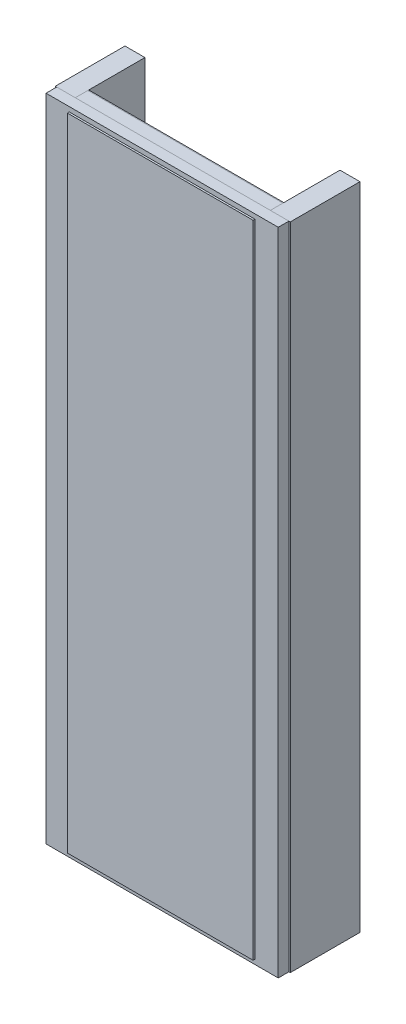
ISO-10303-21;
HEADER;
FILE_DESCRIPTION(('STEP AP214'),'2;1');
FILE_NAME('part.step','',(''),(''),'','','');
FILE_SCHEMA(('AUTOMOTIVE_DESIGN { 1 0 10303 214 1 1 1 1 }'));
ENDSEC;
DATA;
#1=APPLICATION_CONTEXT('core data for automotive mechanical design processes');
#2=APPLICATION_PROTOCOL_DEFINITION('international standard','automotive_design',2000,#1);
#3=PRODUCT_CONTEXT('',#1,'mechanical');
#4=PRODUCT('Part','Part','',(#3));
#5=PRODUCT_RELATED_PRODUCT_CATEGORY('part','',(#4));
#6=PRODUCT_DEFINITION_FORMATION('','',#4);
#7=PRODUCT_DEFINITION_CONTEXT('part definition',#1,'design');
#8=PRODUCT_DEFINITION('design','',#6,#7);
#9=PRODUCT_DEFINITION_SHAPE('','',#8);
#10=(LENGTH_UNIT() NAMED_UNIT(*) SI_UNIT(.MILLI.,.METRE.));
#11=(NAMED_UNIT(*) PLANE_ANGLE_UNIT() SI_UNIT($,.RADIAN.));
#12=(NAMED_UNIT(*) SI_UNIT($,.STERADIAN.) SOLID_ANGLE_UNIT());
#13=UNCERTAINTY_MEASURE_WITH_UNIT(LENGTH_MEASURE(1.E-05),#10,'distance_accuracy_value','');
#14=(GEOMETRIC_REPRESENTATION_CONTEXT(3) GLOBAL_UNCERTAINTY_ASSIGNED_CONTEXT((#13)) GLOBAL_UNIT_ASSIGNED_CONTEXT((#10,
#11,#12)) REPRESENTATION_CONTEXT('',''));
#15=CARTESIAN_POINT('',(0.,0.,0.));
#16=DIRECTION('',(0.,0.,1.));
#17=DIRECTION('',(1.,0.,0.));
#18=AXIS2_PLACEMENT_3D('',#15,#16,#17);
#19=CARTESIAN_POINT('',(0.,0.,8.65));
#20=DIRECTION('',(0.,0.,1.));
#21=DIRECTION('',(1.,0.,0.));
#22=AXIS2_PLACEMENT_3D('',#19,#20,#21);
#23=PLANE('',#22);
#24=DIRECTION('',(1.,0.,0.));
#25=VECTOR('',#24,1.);
#26=CARTESIAN_POINT('',(10.,34.5,8.65));
#27=LINE('',#26,#25);
#28=CARTESIAN_POINT('',(-10.,34.5,8.65));
#29=VERTEX_POINT('',#28);
#30=CARTESIAN_POINT('',(9.99999999999999,34.5,8.65));
#31=VERTEX_POINT('',#30);
#32=EDGE_CURVE('P0_E81',#29,#31,#27,.T.);
#33=ORIENTED_EDGE('',*,*,#32,.T.);
#34=DIRECTION('',(0.,-1.,0.));
#35=VECTOR('',#34,1.);
#36=CARTESIAN_POINT('',(10.,-34.5,8.65));
#37=LINE('',#36,#35);
#38=CARTESIAN_POINT('',(10.,-34.5,8.65));
#39=VERTEX_POINT('',#38);
#40=EDGE_CURVE('P0_E68',#31,#39,#37,.T.);
#41=ORIENTED_EDGE('',*,*,#40,.T.);
#42=DIRECTION('',(1.,0.,0.));
#43=VECTOR('',#42,1.);
#44=CARTESIAN_POINT('',(-10.,-34.5,8.65));
#45=LINE('',#44,#43);
#46=CARTESIAN_POINT('',(-10.,-34.5,8.65));
#47=VERTEX_POINT('',#46);
#48=EDGE_CURVE('P0_E55',#39,#47,#45,.F.);
#49=ORIENTED_EDGE('',*,*,#48,.T.);
#50=DIRECTION('',(0.,1.,0.));
#51=VECTOR('',#50,1.);
#52=CARTESIAN_POINT('',(-10.,34.5,8.65));
#53=LINE('',#52,#51);
#54=EDGE_CURVE('P0_E20',#47,#29,#53,.T.);
#55=ORIENTED_EDGE('',*,*,#54,.T.);
#56=EDGE_LOOP('',(#33,#41,#49,#55));
#57=FACE_BOUND('',#56,.T.);
#58=ADVANCED_FACE('P0_F17',(#57),#23,.F.);
#59=CARTESIAN_POINT('',(-10.,34.5,8.85));
#60=DIRECTION('',(1.,0.,0.));
#61=DIRECTION('',(0.,1.,0.));
#62=AXIS2_PLACEMENT_3D('',#59,#60,#61);
#63=PLANE('',#62);
#64=DIRECTION('',(0.,0.,1.));
#65=VECTOR('',#64,1.);
#66=CARTESIAN_POINT('',(-10.,-34.5,8.85));
#67=LINE('',#66,#65);
#68=CARTESIAN_POINT('',(-10.,-34.5,8.85));
#69=VERTEX_POINT('',#68);
#70=EDGE_CURVE('P0_E61',#47,#69,#67,.T.);
#71=ORIENTED_EDGE('',*,*,#70,.T.);
#72=DIRECTION('',(0.,1.,0.));
#73=VECTOR('',#72,1.);
#74=CARTESIAN_POINT('',(-10.,0.,8.85));
#75=LINE('',#74,#73);
#76=CARTESIAN_POINT('',(-10.,34.5,8.85));
#77=VERTEX_POINT('',#76);
#78=EDGE_CURVE('P0_E83',#77,#69,#75,.F.);
#79=ORIENTED_EDGE('',*,*,#78,.F.);
#80=DIRECTION('',(0.,0.,-1.));
#81=VECTOR('',#80,1.);
#82=CARTESIAN_POINT('',(-10.,34.5,8.85));
#83=LINE('',#82,#81);
#84=EDGE_CURVE('P0_E64',#77,#29,#83,.T.);
#85=ORIENTED_EDGE('',*,*,#84,.T.);
#86=ORIENTED_EDGE('',*,*,#54,.F.);
#87=EDGE_LOOP('',(#71,#79,#85,#86));
#88=FACE_BOUND('',#87,.T.);
#89=ADVANCED_FACE('P0_F60',(#88),#63,.F.);
#90=CARTESIAN_POINT('',(-10.,-34.5,8.85));
#91=DIRECTION('',(0.,1.,0.));
#92=DIRECTION('',(0.,0.,1.));
#93=AXIS2_PLACEMENT_3D('',#90,#91,#92);
#94=PLANE('',#93);
#95=DIRECTION('',(0.,0.,1.));
#96=VECTOR('',#95,1.);
#97=CARTESIAN_POINT('',(10.,-34.5,8.85));
#98=LINE('',#97,#96);
#99=CARTESIAN_POINT('',(10.,-34.5,8.85));
#100=VERTEX_POINT('',#99);
#101=EDGE_CURVE('P0_E70',#39,#100,#98,.T.);
#102=ORIENTED_EDGE('',*,*,#101,.T.);
#103=DIRECTION('',(1.,0.,0.));
#104=VECTOR('',#103,1.);
#105=CARTESIAN_POINT('',(0.,-34.5,8.85));
#106=LINE('',#105,#104);
#107=EDGE_CURVE('P0_E74',#69,#100,#106,.T.);
#108=ORIENTED_EDGE('',*,*,#107,.F.);
#109=ORIENTED_EDGE('',*,*,#70,.F.);
#110=ORIENTED_EDGE('',*,*,#48,.F.);
#111=EDGE_LOOP('',(#102,#108,#109,#110));
#112=FACE_BOUND('',#111,.T.);
#113=ADVANCED_FACE('P0_F72',(#112),#94,.F.);
#114=CARTESIAN_POINT('',(10.,-34.5,8.85));
#115=DIRECTION('',(-1.,0.,0.));
#116=DIRECTION('',(0.,-1.,0.));
#117=AXIS2_PLACEMENT_3D('',#114,#115,#116);
#118=PLANE('',#117);
#119=DIRECTION('',(0.,0.,-1.));
#120=VECTOR('',#119,1.);
#121=CARTESIAN_POINT('',(10.,34.5,8.85));
#122=LINE('',#121,#120);
#123=CARTESIAN_POINT('',(9.99999999999999,34.5,8.85));
#124=VERTEX_POINT('',#123);
#125=EDGE_CURVE('P0_E35',#31,#124,#122,.F.);
#126=ORIENTED_EDGE('',*,*,#125,.T.);
#127=DIRECTION('',(0.,1.,0.));
#128=VECTOR('',#127,1.);
#129=CARTESIAN_POINT('',(10.,0.,8.85));
#130=LINE('',#129,#128);
#131=EDGE_CURVE('P0_E26',#100,#124,#130,.T.);
#132=ORIENTED_EDGE('',*,*,#131,.F.);
#133=ORIENTED_EDGE('',*,*,#101,.F.);
#134=ORIENTED_EDGE('',*,*,#40,.F.);
#135=EDGE_LOOP('',(#126,#132,#133,#134));
#136=FACE_BOUND('',#135,.T.);
#137=ADVANCED_FACE('P0_F89',(#136),#118,.F.);
#138=CARTESIAN_POINT('',(10.,34.5,8.85));
#139=DIRECTION('',(0.,-1.,0.));
#140=DIRECTION('',(0.,0.,-1.));
#141=AXIS2_PLACEMENT_3D('',#138,#139,#140);
#142=PLANE('',#141);
#143=ORIENTED_EDGE('',*,*,#84,.F.);
#144=DIRECTION('',(1.,0.,0.));
#145=VECTOR('',#144,1.);
#146=CARTESIAN_POINT('',(0.,34.5,8.85));
#147=LINE('',#146,#145);
#148=EDGE_CURVE('P0_E11',#124,#77,#147,.F.);
#149=ORIENTED_EDGE('',*,*,#148,.F.);
#150=ORIENTED_EDGE('',*,*,#125,.F.);
#151=ORIENTED_EDGE('',*,*,#32,.F.);
#152=EDGE_LOOP('',(#143,#149,#150,#151));
#153=FACE_BOUND('',#152,.T.);
#154=ADVANCED_FACE('P0_F91',(#153),#142,.F.);
#155=CARTESIAN_POINT('',(0.,0.,8.85));
#156=DIRECTION('',(0.,0.,1.));
#157=DIRECTION('',(1.,0.,0.));
#158=AXIS2_PLACEMENT_3D('',#155,#156,#157);
#159=PLANE('',#158);
#160=ORIENTED_EDGE('',*,*,#131,.T.);
#161=ORIENTED_EDGE('',*,*,#148,.T.);
#162=ORIENTED_EDGE('',*,*,#78,.T.);
#163=ORIENTED_EDGE('',*,*,#107,.T.);
#164=EDGE_LOOP('',(#160,#161,#162,#163));
#165=FACE_BOUND('',#164,.T.);
#166=ADVANCED_FACE('P0_F88',(#165),#159,.T.);
#167=CLOSED_SHELL('',(#58,#89,#113,#137,#154,#166));
#168=MANIFOLD_SOLID_BREP('P0_B1',#167);
#169=CARTESIAN_POINT('',(-10.5,35.,0.));
#170=DIRECTION('',(-1.,0.,0.));
#171=DIRECTION('',(0.,0.,1.));
#172=AXIS2_PLACEMENT_3D('',#169,#170,#171);
#173=PLANE('',#172);
#174=DIRECTION('',(0.,0.,1.));
#175=VECTOR('',#174,1.);
#176=CARTESIAN_POINT('',(-10.5,-35.,0.));
#177=LINE('',#176,#175);
#178=CARTESIAN_POINT('',(-10.5,-35.,7.5));
#179=VERTEX_POINT('',#178);
#180=CARTESIAN_POINT('',(-10.5,-35.,0.));
#181=VERTEX_POINT('',#180);
#182=EDGE_CURVE('P1_E20',#179,#181,#177,.F.);
#183=ORIENTED_EDGE('',*,*,#182,.T.);
#184=DIRECTION('',(0.,1.,0.));
#185=VECTOR('',#184,1.);
#186=CARTESIAN_POINT('',(-10.5,0.,0.));
#187=LINE('',#186,#185);
#188=CARTESIAN_POINT('',(-10.5,35.,0.));
#189=VERTEX_POINT('',#188);
#190=EDGE_CURVE('P1_E55',#189,#181,#187,.F.);
#191=ORIENTED_EDGE('',*,*,#190,.F.);
#192=DIRECTION('',(0.,0.,-1.));
#193=VECTOR('',#192,1.);
#194=CARTESIAN_POINT('',(-10.5,35.,0.));
#195=LINE('',#194,#193);
#196=CARTESIAN_POINT('',(-10.5,35.,7.5));
#197=VERTEX_POINT('',#196);
#198=EDGE_CURVE('P1_E74',#189,#197,#195,.F.);
#199=ORIENTED_EDGE('',*,*,#198,.T.);
#200=DIRECTION('',(0.,1.,0.));
#201=VECTOR('',#200,1.);
#202=CARTESIAN_POINT('',(-10.5,0.,7.5));
#203=LINE('',#202,#201);
#204=EDGE_CURVE('P1_E66',#197,#179,#203,.F.);
#205=ORIENTED_EDGE('',*,*,#204,.T.);
#206=EDGE_LOOP('',(#183,#191,#199,#205));
#207=FACE_BOUND('',#206,.T.);
#208=ADVANCED_FACE('P1_F17',(#207),#173,.F.);
#209=CARTESIAN_POINT('',(-10.5,-35.,0.));
#210=DIRECTION('',(0.,1.,0.));
#211=DIRECTION('',(0.,0.,1.));
#212=AXIS2_PLACEMENT_3D('',#209,#210,#211);
#213=PLANE('',#212);
#214=DIRECTION('',(0.,0.,1.));
#215=VECTOR('',#214,1.);
#216=CARTESIAN_POINT('',(-12.65,-35.,0.));
#217=LINE('',#216,#215);
#218=CARTESIAN_POINT('',(-12.65,-35.,7.5));
#219=VERTEX_POINT('',#218);
#220=CARTESIAN_POINT('',(-12.65,-35.,0.));
#221=VERTEX_POINT('',#220);
#222=EDGE_CURVE('P1_E72',#219,#221,#217,.F.);
#223=ORIENTED_EDGE('',*,*,#222,.T.);
#224=DIRECTION('',(-1.,0.,0.));
#225=VECTOR('',#224,1.);
#226=CARTESIAN_POINT('',(0.,-35.,0.));
#227=LINE('',#226,#225);
#228=EDGE_CURVE('P1_E62',#181,#221,#227,.T.);
#229=ORIENTED_EDGE('',*,*,#228,.F.);
#230=ORIENTED_EDGE('',*,*,#182,.F.);
#231=DIRECTION('',(-1.,0.,0.));
#232=VECTOR('',#231,1.);
#233=CARTESIAN_POINT('',(0.,-35.,7.5));
#234=LINE('',#233,#232);
#235=EDGE_CURVE('P1_E80',#179,#219,#234,.T.);
#236=ORIENTED_EDGE('',*,*,#235,.T.);
#237=EDGE_LOOP('',(#223,#229,#230,#236));
#238=FACE_BOUND('',#237,.T.);
#239=ADVANCED_FACE('P1_F71',(#238),#213,.F.);
#240=CARTESIAN_POINT('',(0.,0.,0.));
#241=DIRECTION('',(0.,0.,-1.));
#242=DIRECTION('',(-1.,0.,0.));
#243=AXIS2_PLACEMENT_3D('',#240,#241,#242);
#244=PLANE('',#243);
#245=ORIENTED_EDGE('',*,*,#190,.T.);
#246=ORIENTED_EDGE('',*,*,#228,.T.);
#247=DIRECTION('',(0.,1.,0.));
#248=VECTOR('',#247,1.);
#249=CARTESIAN_POINT('',(-12.65,-35.,0.));
#250=LINE('',#249,#248);
#251=CARTESIAN_POINT('',(-12.65,35.,0.));
#252=VERTEX_POINT('',#251);
#253=EDGE_CURVE('P1_E83',#221,#252,#250,.T.);
#254=ORIENTED_EDGE('',*,*,#253,.T.);
#255=DIRECTION('',(1.,0.,0.));
#256=VECTOR('',#255,1.);
#257=CARTESIAN_POINT('',(-12.65,35.,0.));
#258=LINE('',#257,#256);
#259=EDGE_CURVE('P1_E64',#252,#189,#258,.T.);
#260=ORIENTED_EDGE('',*,*,#259,.T.);
#261=EDGE_LOOP('',(#245,#246,#254,#260));
#262=FACE_BOUND('',#261,.T.);
#263=ADVANCED_FACE('P1_F59',(#262),#244,.T.);
#264=CARTESIAN_POINT('',(-12.65,35.,0.));
#265=DIRECTION('',(0.,-1.,0.));
#266=DIRECTION('',(0.,0.,-1.));
#267=AXIS2_PLACEMENT_3D('',#264,#265,#266);
#268=PLANE('',#267);
#269=ORIENTED_EDGE('',*,*,#198,.F.);
#270=ORIENTED_EDGE('',*,*,#259,.F.);
#271=DIRECTION('',(0.,0.,1.));
#272=VECTOR('',#271,1.);
#273=CARTESIAN_POINT('',(-12.65,35.,0.));
#274=LINE('',#273,#272);
#275=CARTESIAN_POINT('',(-12.65,35.,7.5));
#276=VERTEX_POINT('',#275);
#277=EDGE_CURVE('P1_E26',#252,#276,#274,.T.);
#278=ORIENTED_EDGE('',*,*,#277,.T.);
#279=DIRECTION('',(-1.,0.,0.));
#280=VECTOR('',#279,1.);
#281=CARTESIAN_POINT('',(0.,35.,7.5));
#282=LINE('',#281,#280);
#283=EDGE_CURVE('P1_E34',#276,#197,#282,.F.);
#284=ORIENTED_EDGE('',*,*,#283,.T.);
#285=EDGE_LOOP('',(#269,#270,#278,#284));
#286=FACE_BOUND('',#285,.T.);
#287=ADVANCED_FACE('P1_F88',(#286),#268,.F.);
#288=CARTESIAN_POINT('',(0.,0.,7.5));
#289=DIRECTION('',(0.,0.,-1.));
#290=DIRECTION('',(-1.,0.,0.));
#291=AXIS2_PLACEMENT_3D('',#288,#289,#290);
#292=PLANE('',#291);
#293=ORIENTED_EDGE('',*,*,#235,.F.);
#294=ORIENTED_EDGE('',*,*,#204,.F.);
#295=ORIENTED_EDGE('',*,*,#283,.F.);
#296=DIRECTION('',(0.,1.,0.));
#297=VECTOR('',#296,1.);
#298=CARTESIAN_POINT('',(-12.65,-35.,7.5));
#299=LINE('',#298,#297);
#300=EDGE_CURVE('P1_E11',#276,#219,#299,.F.);
#301=ORIENTED_EDGE('',*,*,#300,.T.);
#302=EDGE_LOOP('',(#293,#294,#295,#301));
#303=FACE_BOUND('',#302,.T.);
#304=ADVANCED_FACE('P1_F91',(#303),#292,.F.);
#305=CARTESIAN_POINT('',(-12.65,-35.,0.));
#306=DIRECTION('',(1.,0.,0.));
#307=DIRECTION('',(0.,1.,0.));
#308=AXIS2_PLACEMENT_3D('',#305,#306,#307);
#309=PLANE('',#308);
#310=ORIENTED_EDGE('',*,*,#277,.F.);
#311=ORIENTED_EDGE('',*,*,#253,.F.);
#312=ORIENTED_EDGE('',*,*,#222,.F.);
#313=ORIENTED_EDGE('',*,*,#300,.F.);
#314=EDGE_LOOP('',(#310,#311,#312,#313));
#315=FACE_BOUND('',#314,.T.);
#316=ADVANCED_FACE('P1_F90',(#315),#309,.F.);
#317=CLOSED_SHELL('',(#208,#239,#263,#287,#304,#316));
#318=MANIFOLD_SOLID_BREP('P1_B1',#317);
#319=CARTESIAN_POINT('',(0.,0.,6.15));
#320=DIRECTION('',(0.,0.,-1.));
#321=DIRECTION('',(-1.,0.,0.));
#322=AXIS2_PLACEMENT_3D('',#319,#320,#321);
#323=PLANE('',#322);
#324=DIRECTION('',(1.,0.,0.));
#325=VECTOR('',#324,1.);
#326=CARTESIAN_POINT('',(10.5,-35.,6.15));
#327=LINE('',#326,#325);
#328=CARTESIAN_POINT('',(-10.5,-35.,6.15));
#329=VERTEX_POINT('',#328);
#330=CARTESIAN_POINT('',(10.5,-35.,6.15));
#331=VERTEX_POINT('',#330);
#332=EDGE_CURVE('P2_E81',#329,#331,#327,.T.);
#333=ORIENTED_EDGE('',*,*,#332,.T.);
#334=DIRECTION('',(0.,1.,0.));
#335=VECTOR('',#334,1.);
#336=CARTESIAN_POINT('',(10.5,35.,6.15));
#337=LINE('',#336,#335);
#338=CARTESIAN_POINT('',(10.5,35.,6.15));
#339=VERTEX_POINT('',#338);
#340=EDGE_CURVE('P2_E68',#331,#339,#337,.T.);
#341=ORIENTED_EDGE('',*,*,#340,.T.);
#342=DIRECTION('',(1.,0.,0.));
#343=VECTOR('',#342,1.);
#344=CARTESIAN_POINT('',(-10.5,35.,6.15));
#345=LINE('',#344,#343);
#346=CARTESIAN_POINT('',(-10.5,35.,6.15));
#347=VERTEX_POINT('',#346);
#348=EDGE_CURVE('P2_E55',#339,#347,#345,.F.);
#349=ORIENTED_EDGE('',*,*,#348,.T.);
#350=DIRECTION('',(0.,1.,0.));
#351=VECTOR('',#350,1.);
#352=CARTESIAN_POINT('',(-10.5,-35.,6.15));
#353=LINE('',#352,#351);
#354=EDGE_CURVE('P2_E20',#347,#329,#353,.F.);
#355=ORIENTED_EDGE('',*,*,#354,.T.);
#356=EDGE_LOOP('',(#333,#341,#349,#355));
#357=FACE_BOUND('',#356,.T.);
#358=ADVANCED_FACE('P2_F17',(#357),#323,.F.);
#359=CARTESIAN_POINT('',(-10.5,-35.,6.05));
#360=DIRECTION('',(1.,0.,0.));
#361=DIRECTION('',(0.,0.,-1.));
#362=AXIS2_PLACEMENT_3D('',#359,#360,#361);
#363=PLANE('',#362);
#364=DIRECTION('',(0.,0.,-1.));
#365=VECTOR('',#364,1.);
#366=CARTESIAN_POINT('',(-10.5,35.,6.05));
#367=LINE('',#366,#365);
#368=CARTESIAN_POINT('',(-10.5,35.,6.05));
#369=VERTEX_POINT('',#368);
#370=EDGE_CURVE('P2_E61',#347,#369,#367,.T.);
#371=ORIENTED_EDGE('',*,*,#370,.T.);
#372=DIRECTION('',(0.,1.,0.));
#373=VECTOR('',#372,1.);
#374=CARTESIAN_POINT('',(-10.5,0.,6.05));
#375=LINE('',#374,#373);
#376=CARTESIAN_POINT('',(-10.5,-35.,6.05));
#377=VERTEX_POINT('',#376);
#378=EDGE_CURVE('P2_E83',#377,#369,#375,.T.);
#379=ORIENTED_EDGE('',*,*,#378,.F.);
#380=DIRECTION('',(0.,0.,1.));
#381=VECTOR('',#380,1.);
#382=CARTESIAN_POINT('',(-10.5,-35.,6.05));
#383=LINE('',#382,#381);
#384=EDGE_CURVE('P2_E64',#377,#329,#383,.T.);
#385=ORIENTED_EDGE('',*,*,#384,.T.);
#386=ORIENTED_EDGE('',*,*,#354,.F.);
#387=EDGE_LOOP('',(#371,#379,#385,#386));
#388=FACE_BOUND('',#387,.T.);
#389=ADVANCED_FACE('P2_F60',(#388),#363,.F.);
#390=CARTESIAN_POINT('',(-10.5,35.,6.05));
#391=DIRECTION('',(0.,-1.,0.));
#392=DIRECTION('',(0.,0.,-1.));
#393=AXIS2_PLACEMENT_3D('',#390,#391,#392);
#394=PLANE('',#393);
#395=DIRECTION('',(0.,0.,1.));
#396=VECTOR('',#395,1.);
#397=CARTESIAN_POINT('',(10.5,35.,6.05));
#398=LINE('',#397,#396);
#399=CARTESIAN_POINT('',(10.5,35.,6.05));
#400=VERTEX_POINT('',#399);
#401=EDGE_CURVE('P2_E70',#339,#400,#398,.F.);
#402=ORIENTED_EDGE('',*,*,#401,.T.);
#403=DIRECTION('',(-1.,0.,0.));
#404=VECTOR('',#403,1.);
#405=CARTESIAN_POINT('',(0.,35.,6.05));
#406=LINE('',#405,#404);
#407=EDGE_CURVE('P2_E74',#369,#400,#406,.F.);
#408=ORIENTED_EDGE('',*,*,#407,.F.);
#409=ORIENTED_EDGE('',*,*,#370,.F.);
#410=ORIENTED_EDGE('',*,*,#348,.F.);
#411=EDGE_LOOP('',(#402,#408,#409,#410));
#412=FACE_BOUND('',#411,.T.);
#413=ADVANCED_FACE('P2_F72',(#412),#394,.F.);
#414=CARTESIAN_POINT('',(10.5,35.,6.05));
#415=DIRECTION('',(-1.,0.,0.));
#416=DIRECTION('',(0.,0.,1.));
#417=AXIS2_PLACEMENT_3D('',#414,#415,#416);
#418=PLANE('',#417);
#419=DIRECTION('',(0.,0.,1.));
#420=VECTOR('',#419,1.);
#421=CARTESIAN_POINT('',(10.5,-35.,6.05));
#422=LINE('',#421,#420);
#423=CARTESIAN_POINT('',(10.5,-35.,6.05));
#424=VERTEX_POINT('',#423);
#425=EDGE_CURVE('P2_E35',#331,#424,#422,.F.);
#426=ORIENTED_EDGE('',*,*,#425,.T.);
#427=DIRECTION('',(0.,1.,0.));
#428=VECTOR('',#427,1.);
#429=CARTESIAN_POINT('',(10.5,0.,6.05));
#430=LINE('',#429,#428);
#431=EDGE_CURVE('P2_E26',#400,#424,#430,.F.);
#432=ORIENTED_EDGE('',*,*,#431,.F.);
#433=ORIENTED_EDGE('',*,*,#401,.F.);
#434=ORIENTED_EDGE('',*,*,#340,.F.);
#435=EDGE_LOOP('',(#426,#432,#433,#434));
#436=FACE_BOUND('',#435,.T.);
#437=ADVANCED_FACE('P2_F89',(#436),#418,.F.);
#438=CARTESIAN_POINT('',(10.5,-35.,6.05));
#439=DIRECTION('',(0.,1.,0.));
#440=DIRECTION('',(0.,0.,1.));
#441=AXIS2_PLACEMENT_3D('',#438,#439,#440);
#442=PLANE('',#441);
#443=ORIENTED_EDGE('',*,*,#384,.F.);
#444=DIRECTION('',(-1.,0.,0.));
#445=VECTOR('',#444,1.);
#446=CARTESIAN_POINT('',(0.,-35.,6.05));
#447=LINE('',#446,#445);
#448=EDGE_CURVE('P2_E11',#424,#377,#447,.T.);
#449=ORIENTED_EDGE('',*,*,#448,.F.);
#450=ORIENTED_EDGE('',*,*,#425,.F.);
#451=ORIENTED_EDGE('',*,*,#332,.F.);
#452=EDGE_LOOP('',(#443,#449,#450,#451));
#453=FACE_BOUND('',#452,.T.);
#454=ADVANCED_FACE('P2_F91',(#453),#442,.F.);
#455=CARTESIAN_POINT('',(0.,0.,6.05));
#456=DIRECTION('',(0.,0.,-1.));
#457=DIRECTION('',(-1.,0.,0.));
#458=AXIS2_PLACEMENT_3D('',#455,#456,#457);
#459=PLANE('',#458);
#460=ORIENTED_EDGE('',*,*,#431,.T.);
#461=ORIENTED_EDGE('',*,*,#448,.T.);
#462=ORIENTED_EDGE('',*,*,#378,.T.);
#463=ORIENTED_EDGE('',*,*,#407,.T.);
#464=EDGE_LOOP('',(#460,#461,#462,#463));
#465=FACE_BOUND('',#464,.T.);
#466=ADVANCED_FACE('P2_F88',(#465),#459,.T.);
#467=CLOSED_SHELL('',(#358,#389,#413,#437,#454,#466));
#468=MANIFOLD_SOLID_BREP('P2_B1',#467);
#469=CARTESIAN_POINT('',(0.,0.,8.65));
#470=DIRECTION('',(0.,0.,-1.));
#471=DIRECTION('',(-1.,0.,0.));
#472=AXIS2_PLACEMENT_3D('',#469,#470,#471);
#473=PLANE('',#472);
#474=DIRECTION('',(0.,-1.,0.));
#475=VECTOR('',#474,1.);
#476=CARTESIAN_POINT('',(12.5,35.,8.65));
#477=LINE('',#476,#475);
#478=CARTESIAN_POINT('',(12.5,-35.,8.65));
#479=VERTEX_POINT('',#478);
#480=CARTESIAN_POINT('',(12.5,35.,8.65));
#481=VERTEX_POINT('',#480);
#482=EDGE_CURVE('P3_E81',#479,#481,#477,.F.);
#483=ORIENTED_EDGE('',*,*,#482,.T.);
#484=DIRECTION('',(1.,0.,0.));
#485=VECTOR('',#484,1.);
#486=CARTESIAN_POINT('',(-12.5,35.,8.65));
#487=LINE('',#486,#485);
#488=CARTESIAN_POINT('',(-12.5,35.,8.65));
#489=VERTEX_POINT('',#488);
#490=EDGE_CURVE('P3_E68',#481,#489,#487,.F.);
#491=ORIENTED_EDGE('',*,*,#490,.T.);
#492=DIRECTION('',(0.,1.,0.));
#493=VECTOR('',#492,1.);
#494=CARTESIAN_POINT('',(-12.5,-35.,8.65));
#495=LINE('',#494,#493);
#496=CARTESIAN_POINT('',(-12.5,-35.,8.65));
#497=VERTEX_POINT('',#496);
#498=EDGE_CURVE('P3_E55',#489,#497,#495,.F.);
#499=ORIENTED_EDGE('',*,*,#498,.T.);
#500=DIRECTION('',(-1.,0.,0.));
#501=VECTOR('',#500,1.);
#502=CARTESIAN_POINT('',(12.5,-35.,8.65));
#503=LINE('',#502,#501);
#504=EDGE_CURVE('P3_E20',#497,#479,#503,.F.);
#505=ORIENTED_EDGE('',*,*,#504,.T.);
#506=EDGE_LOOP('',(#483,#491,#499,#505));
#507=FACE_BOUND('',#506,.T.);
#508=ADVANCED_FACE('P3_F17',(#507),#473,.F.);
#509=CARTESIAN_POINT('',(12.5,-35.,7.5));
#510=DIRECTION('',(0.,1.,0.));
#511=DIRECTION('',(-1.,0.,0.));
#512=AXIS2_PLACEMENT_3D('',#509,#510,#511);
#513=PLANE('',#512);
#514=DIRECTION('',(0.,0.,1.));
#515=VECTOR('',#514,1.);
#516=CARTESIAN_POINT('',(-12.5,-35.,7.5));
#517=LINE('',#516,#515);
#518=CARTESIAN_POINT('',(-12.5,-35.,7.5));
#519=VERTEX_POINT('',#518);
#520=EDGE_CURVE('P3_E61',#497,#519,#517,.F.);
#521=ORIENTED_EDGE('',*,*,#520,.T.);
#522=DIRECTION('',(-1.,0.,0.));
#523=VECTOR('',#522,1.);
#524=CARTESIAN_POINT('',(0.,-35.,7.5));
#525=LINE('',#524,#523);
#526=CARTESIAN_POINT('',(12.5,-35.,7.5));
#527=VERTEX_POINT('',#526);
#528=EDGE_CURVE('P3_E83',#527,#519,#525,.T.);
#529=ORIENTED_EDGE('',*,*,#528,.F.);
#530=DIRECTION('',(0.,0.,1.));
#531=VECTOR('',#530,1.);
#532=CARTESIAN_POINT('',(12.5,-35.,7.5));
#533=LINE('',#532,#531);
#534=EDGE_CURVE('P3_E64',#527,#479,#533,.T.);
#535=ORIENTED_EDGE('',*,*,#534,.T.);
#536=ORIENTED_EDGE('',*,*,#504,.F.);
#537=EDGE_LOOP('',(#521,#529,#535,#536));
#538=FACE_BOUND('',#537,.T.);
#539=ADVANCED_FACE('P3_F60',(#538),#513,.F.);
#540=CARTESIAN_POINT('',(-12.5,-35.,7.5));
#541=DIRECTION('',(1.,0.,0.));
#542=DIRECTION('',(0.,1.,0.));
#543=AXIS2_PLACEMENT_3D('',#540,#541,#542);
#544=PLANE('',#543);
#545=DIRECTION('',(0.,0.,1.));
#546=VECTOR('',#545,1.);
#547=CARTESIAN_POINT('',(-12.5,35.,7.5));
#548=LINE('',#547,#546);
#549=CARTESIAN_POINT('',(-12.5,35.,7.5));
#550=VERTEX_POINT('',#549);
#551=EDGE_CURVE('P3_E70',#489,#550,#548,.F.);
#552=ORIENTED_EDGE('',*,*,#551,.T.);
#553=DIRECTION('',(0.,1.,0.));
#554=VECTOR('',#553,1.);
#555=CARTESIAN_POINT('',(-12.5,0.,7.5));
#556=LINE('',#555,#554);
#557=EDGE_CURVE('P3_E74',#519,#550,#556,.T.);
#558=ORIENTED_EDGE('',*,*,#557,.F.);
#559=ORIENTED_EDGE('',*,*,#520,.F.);
#560=ORIENTED_EDGE('',*,*,#498,.F.);
#561=EDGE_LOOP('',(#552,#558,#559,#560));
#562=FACE_BOUND('',#561,.T.);
#563=ADVANCED_FACE('P3_F72',(#562),#544,.F.);
#564=CARTESIAN_POINT('',(-12.5,35.,7.5));
#565=DIRECTION('',(0.,-1.,0.));
#566=DIRECTION('',(1.,0.,0.));
#567=AXIS2_PLACEMENT_3D('',#564,#565,#566);
#568=PLANE('',#567);
#569=DIRECTION('',(0.,0.,1.));
#570=VECTOR('',#569,1.);
#571=CARTESIAN_POINT('',(12.5,35.,7.5));
#572=LINE('',#571,#570);
#573=CARTESIAN_POINT('',(12.5,35.,7.5));
#574=VERTEX_POINT('',#573);
#575=EDGE_CURVE('P3_E35',#481,#574,#572,.F.);
#576=ORIENTED_EDGE('',*,*,#575,.T.);
#577=DIRECTION('',(-1.,0.,0.));
#578=VECTOR('',#577,1.);
#579=CARTESIAN_POINT('',(0.,35.,7.5));
#580=LINE('',#579,#578);
#581=EDGE_CURVE('P3_E26',#550,#574,#580,.F.);
#582=ORIENTED_EDGE('',*,*,#581,.F.);
#583=ORIENTED_EDGE('',*,*,#551,.F.);
#584=ORIENTED_EDGE('',*,*,#490,.F.);
#585=EDGE_LOOP('',(#576,#582,#583,#584));
#586=FACE_BOUND('',#585,.T.);
#587=ADVANCED_FACE('P3_F89',(#586),#568,.F.);
#588=CARTESIAN_POINT('',(12.5,35.,7.5));
#589=DIRECTION('',(-1.,0.,0.));
#590=DIRECTION('',(0.,-1.,0.));
#591=AXIS2_PLACEMENT_3D('',#588,#589,#590);
#592=PLANE('',#591);
#593=ORIENTED_EDGE('',*,*,#534,.F.);
#594=DIRECTION('',(0.,1.,0.));
#595=VECTOR('',#594,1.);
#596=CARTESIAN_POINT('',(12.5,0.,7.5));
#597=LINE('',#596,#595);
#598=EDGE_CURVE('P3_E11',#574,#527,#597,.F.);
#599=ORIENTED_EDGE('',*,*,#598,.F.);
#600=ORIENTED_EDGE('',*,*,#575,.F.);
#601=ORIENTED_EDGE('',*,*,#482,.F.);
#602=EDGE_LOOP('',(#593,#599,#600,#601));
#603=FACE_BOUND('',#602,.T.);
#604=ADVANCED_FACE('P3_F91',(#603),#592,.F.);
#605=CARTESIAN_POINT('',(0.,0.,7.5));
#606=DIRECTION('',(0.,0.,-1.));
#607=DIRECTION('',(-1.,0.,0.));
#608=AXIS2_PLACEMENT_3D('',#605,#606,#607);
#609=PLANE('',#608);
#610=ORIENTED_EDGE('',*,*,#581,.T.);
#611=ORIENTED_EDGE('',*,*,#598,.T.);
#612=ORIENTED_EDGE('',*,*,#528,.T.);
#613=ORIENTED_EDGE('',*,*,#557,.T.);
#614=EDGE_LOOP('',(#610,#611,#612,#613));
#615=FACE_BOUND('',#614,.T.);
#616=ADVANCED_FACE('P3_F88',(#615),#609,.T.);
#617=CLOSED_SHELL('',(#508,#539,#563,#587,#604,#616));
#618=MANIFOLD_SOLID_BREP('P3_B1',#617);
#619=CARTESIAN_POINT('',(12.65,35.,0.));
#620=DIRECTION('',(-1.,0.,0.));
#621=DIRECTION('',(0.,-1.,0.));
#622=AXIS2_PLACEMENT_3D('',#619,#620,#621);
#623=PLANE('',#622);
#624=DIRECTION('',(0.,0.,1.));
#625=VECTOR('',#624,1.);
#626=CARTESIAN_POINT('',(12.65,-35.,0.));
#627=LINE('',#626,#625);
#628=CARTESIAN_POINT('',(12.65,-35.,7.5));
#629=VERTEX_POINT('',#628);
#630=CARTESIAN_POINT('',(12.65,-35.,0.));
#631=VERTEX_POINT('',#630);
#632=EDGE_CURVE('P4_E20',#629,#631,#627,.F.);
#633=ORIENTED_EDGE('',*,*,#632,.T.);
#634=DIRECTION('',(0.,1.,0.));
#635=VECTOR('',#634,1.);
#636=CARTESIAN_POINT('',(12.65,0.,0.));
#637=LINE('',#636,#635);
#638=CARTESIAN_POINT('',(12.65,35.,0.));
#639=VERTEX_POINT('',#638);
#640=EDGE_CURVE('P4_E55',#639,#631,#637,.F.);
#641=ORIENTED_EDGE('',*,*,#640,.F.);
#642=DIRECTION('',(0.,0.,-1.));
#643=VECTOR('',#642,1.);
#644=CARTESIAN_POINT('',(12.65,35.,0.));
#645=LINE('',#644,#643);
#646=CARTESIAN_POINT('',(12.65,35.,7.5));
#647=VERTEX_POINT('',#646);
#648=EDGE_CURVE('P4_E74',#639,#647,#645,.F.);
#649=ORIENTED_EDGE('',*,*,#648,.T.);
#650=DIRECTION('',(0.,1.,0.));
#651=VECTOR('',#650,1.);
#652=CARTESIAN_POINT('',(12.65,0.,7.5));
#653=LINE('',#652,#651);
#654=EDGE_CURVE('P4_E66',#647,#629,#653,.F.);
#655=ORIENTED_EDGE('',*,*,#654,.T.);
#656=EDGE_LOOP('',(#633,#641,#649,#655));
#657=FACE_BOUND('',#656,.T.);
#658=ADVANCED_FACE('P4_F17',(#657),#623,.F.);
#659=CARTESIAN_POINT('',(12.65,-35.,0.));
#660=DIRECTION('',(0.,1.,0.));
#661=DIRECTION('',(-1.,0.,0.));
#662=AXIS2_PLACEMENT_3D('',#659,#660,#661);
#663=PLANE('',#662);
#664=DIRECTION('',(0.,0.,-1.));
#665=VECTOR('',#664,1.);
#666=CARTESIAN_POINT('',(10.5,-35.,0.));
#667=LINE('',#666,#665);
#668=CARTESIAN_POINT('',(10.5,-35.,7.5));
#669=VERTEX_POINT('',#668);
#670=CARTESIAN_POINT('',(10.5,-35.,0.));
#671=VERTEX_POINT('',#670);
#672=EDGE_CURVE('P4_E72',#669,#671,#667,.T.);
#673=ORIENTED_EDGE('',*,*,#672,.T.);
#674=DIRECTION('',(-1.,0.,0.));
#675=VECTOR('',#674,1.);
#676=CARTESIAN_POINT('',(0.,-35.,0.));
#677=LINE('',#676,#675);
#678=EDGE_CURVE('P4_E62',#631,#671,#677,.T.);
#679=ORIENTED_EDGE('',*,*,#678,.F.);
#680=ORIENTED_EDGE('',*,*,#632,.F.);
#681=DIRECTION('',(-1.,0.,0.));
#682=VECTOR('',#681,1.);
#683=CARTESIAN_POINT('',(0.,-35.,7.5));
#684=LINE('',#683,#682);
#685=EDGE_CURVE('P4_E80',#629,#669,#684,.T.);
#686=ORIENTED_EDGE('',*,*,#685,.T.);
#687=EDGE_LOOP('',(#673,#679,#680,#686));
#688=FACE_BOUND('',#687,.T.);
#689=ADVANCED_FACE('P4_F71',(#688),#663,.F.);
#690=CARTESIAN_POINT('',(0.,0.,0.));
#691=DIRECTION('',(0.,0.,-1.));
#692=DIRECTION('',(-1.,0.,0.));
#693=AXIS2_PLACEMENT_3D('',#690,#691,#692);
#694=PLANE('',#693);
#695=ORIENTED_EDGE('',*,*,#640,.T.);
#696=ORIENTED_EDGE('',*,*,#678,.T.);
#697=DIRECTION('',(0.,1.,0.));
#698=VECTOR('',#697,1.);
#699=CARTESIAN_POINT('',(10.5,-35.,0.));
#700=LINE('',#699,#698);
#701=CARTESIAN_POINT('',(10.5,35.,0.));
#702=VERTEX_POINT('',#701);
#703=EDGE_CURVE('P4_E83',#671,#702,#700,.T.);
#704=ORIENTED_EDGE('',*,*,#703,.T.);
#705=DIRECTION('',(1.,0.,0.));
#706=VECTOR('',#705,1.);
#707=CARTESIAN_POINT('',(10.5,35.,0.));
#708=LINE('',#707,#706);
#709=EDGE_CURVE('P4_E64',#702,#639,#708,.T.);
#710=ORIENTED_EDGE('',*,*,#709,.T.);
#711=EDGE_LOOP('',(#695,#696,#704,#710));
#712=FACE_BOUND('',#711,.T.);
#713=ADVANCED_FACE('P4_F59',(#712),#694,.T.);
#714=CARTESIAN_POINT('',(10.5,35.,0.));
#715=DIRECTION('',(0.,-1.,0.));
#716=DIRECTION('',(0.,0.,-1.));
#717=AXIS2_PLACEMENT_3D('',#714,#715,#716);
#718=PLANE('',#717);
#719=ORIENTED_EDGE('',*,*,#648,.F.);
#720=ORIENTED_EDGE('',*,*,#709,.F.);
#721=DIRECTION('',(0.,0.,-1.));
#722=VECTOR('',#721,1.);
#723=CARTESIAN_POINT('',(10.5,35.,0.));
#724=LINE('',#723,#722);
#725=CARTESIAN_POINT('',(10.5,35.,7.5));
#726=VERTEX_POINT('',#725);
#727=EDGE_CURVE('P4_E26',#702,#726,#724,.F.);
#728=ORIENTED_EDGE('',*,*,#727,.T.);
#729=DIRECTION('',(-1.,0.,0.));
#730=VECTOR('',#729,1.);
#731=CARTESIAN_POINT('',(0.,35.,7.5));
#732=LINE('',#731,#730);
#733=EDGE_CURVE('P4_E34',#726,#647,#732,.F.);
#734=ORIENTED_EDGE('',*,*,#733,.T.);
#735=EDGE_LOOP('',(#719,#720,#728,#734));
#736=FACE_BOUND('',#735,.T.);
#737=ADVANCED_FACE('P4_F88',(#736),#718,.F.);
#738=CARTESIAN_POINT('',(0.,0.,7.5));
#739=DIRECTION('',(0.,0.,-1.));
#740=DIRECTION('',(-1.,0.,0.));
#741=AXIS2_PLACEMENT_3D('',#738,#739,#740);
#742=PLANE('',#741);
#743=ORIENTED_EDGE('',*,*,#685,.F.);
#744=ORIENTED_EDGE('',*,*,#654,.F.);
#745=ORIENTED_EDGE('',*,*,#733,.F.);
#746=DIRECTION('',(0.,1.,0.));
#747=VECTOR('',#746,1.);
#748=CARTESIAN_POINT('',(10.5,-35.,7.5));
#749=LINE('',#748,#747);
#750=EDGE_CURVE('P4_E11',#726,#669,#749,.F.);
#751=ORIENTED_EDGE('',*,*,#750,.T.);
#752=EDGE_LOOP('',(#743,#744,#745,#751));
#753=FACE_BOUND('',#752,.T.);
#754=ADVANCED_FACE('P4_F91',(#753),#742,.F.);
#755=CARTESIAN_POINT('',(10.5,-35.,0.));
#756=DIRECTION('',(1.,0.,0.));
#757=DIRECTION('',(0.,0.,-1.));
#758=AXIS2_PLACEMENT_3D('',#755,#756,#757);
#759=PLANE('',#758);
#760=ORIENTED_EDGE('',*,*,#727,.F.);
#761=ORIENTED_EDGE('',*,*,#703,.F.);
#762=ORIENTED_EDGE('',*,*,#672,.F.);
#763=ORIENTED_EDGE('',*,*,#750,.F.);
#764=EDGE_LOOP('',(#760,#761,#762,#763));
#765=FACE_BOUND('',#764,.T.);
#766=ADVANCED_FACE('P4_F90',(#765),#759,.F.);
#767=CLOSED_SHELL('',(#658,#689,#713,#737,#754,#766));
#768=MANIFOLD_SOLID_BREP('P4_B1',#767);
#769=CARTESIAN_POINT('',(0.,0.,7.5));
#770=DIRECTION('',(0.,0.,-1.));
#771=DIRECTION('',(-1.,0.,0.));
#772=AXIS2_PLACEMENT_3D('',#769,#770,#771);
#773=PLANE('',#772);
#774=DIRECTION('',(-1.,0.,0.));
#775=VECTOR('',#774,1.);
#776=CARTESIAN_POINT('',(10.5,-35.,7.5));
#777=LINE('',#776,#775);
#778=CARTESIAN_POINT('',(-10.5,-35.,7.5));
#779=VERTEX_POINT('',#778);
#780=CARTESIAN_POINT('',(10.5,-35.,7.5));
#781=VERTEX_POINT('',#780);
#782=EDGE_CURVE('P5_E81',#779,#781,#777,.F.);
#783=ORIENTED_EDGE('',*,*,#782,.T.);
#784=DIRECTION('',(0.,-1.,0.));
#785=VECTOR('',#784,1.);
#786=CARTESIAN_POINT('',(10.5,35.,7.5));
#787=LINE('',#786,#785);
#788=CARTESIAN_POINT('',(10.5,35.,7.5));
#789=VERTEX_POINT('',#788);
#790=EDGE_CURVE('P5_E68',#781,#789,#787,.F.);
#791=ORIENTED_EDGE('',*,*,#790,.T.);
#792=DIRECTION('',(1.,0.,0.));
#793=VECTOR('',#792,1.);
#794=CARTESIAN_POINT('',(-10.5,35.,7.5));
#795=LINE('',#794,#793);
#796=CARTESIAN_POINT('',(-10.5,35.,7.5));
#797=VERTEX_POINT('',#796);
#798=EDGE_CURVE('P5_E55',#789,#797,#795,.F.);
#799=ORIENTED_EDGE('',*,*,#798,.T.);
#800=DIRECTION('',(0.,1.,0.));
#801=VECTOR('',#800,1.);
#802=CARTESIAN_POINT('',(-10.5,-35.,7.5));
#803=LINE('',#802,#801);
#804=EDGE_CURVE('P5_E20',#797,#779,#803,.F.);
#805=ORIENTED_EDGE('',*,*,#804,.T.);
#806=EDGE_LOOP('',(#783,#791,#799,#805));
#807=FACE_BOUND('',#806,.T.);
#808=ADVANCED_FACE('P5_F17',(#807),#773,.F.);
#809=CARTESIAN_POINT('',(-10.5,-35.,6.15));
#810=DIRECTION('',(1.,0.,0.));
#811=DIRECTION('',(0.,1.,0.));
#812=AXIS2_PLACEMENT_3D('',#809,#810,#811);
#813=PLANE('',#812);
#814=DIRECTION('',(0.,0.,1.));
#815=VECTOR('',#814,1.);
#816=CARTESIAN_POINT('',(-10.5,35.,6.15));
#817=LINE('',#816,#815);
#818=CARTESIAN_POINT('',(-10.5,35.,6.15));
#819=VERTEX_POINT('',#818);
#820=EDGE_CURVE('P5_E61',#797,#819,#817,.F.);
#821=ORIENTED_EDGE('',*,*,#820,.T.);
#822=DIRECTION('',(0.,1.,0.));
#823=VECTOR('',#822,1.);
#824=CARTESIAN_POINT('',(-10.5,0.,6.15));
#825=LINE('',#824,#823);
#826=CARTESIAN_POINT('',(-10.5,-35.,6.15));
#827=VERTEX_POINT('',#826);
#828=EDGE_CURVE('P5_E83',#827,#819,#825,.T.);
#829=ORIENTED_EDGE('',*,*,#828,.F.);
#830=DIRECTION('',(0.,0.,1.));
#831=VECTOR('',#830,1.);
#832=CARTESIAN_POINT('',(-10.5,-35.,6.15));
#833=LINE('',#832,#831);
#834=EDGE_CURVE('P5_E64',#827,#779,#833,.T.);
#835=ORIENTED_EDGE('',*,*,#834,.T.);
#836=ORIENTED_EDGE('',*,*,#804,.F.);
#837=EDGE_LOOP('',(#821,#829,#835,#836));
#838=FACE_BOUND('',#837,.T.);
#839=ADVANCED_FACE('P5_F60',(#838),#813,.F.);
#840=CARTESIAN_POINT('',(-10.5,35.,6.15));
#841=DIRECTION('',(0.,-1.,0.));
#842=DIRECTION('',(1.,0.,0.));
#843=AXIS2_PLACEMENT_3D('',#840,#841,#842);
#844=PLANE('',#843);
#845=DIRECTION('',(0.,0.,1.));
#846=VECTOR('',#845,1.);
#847=CARTESIAN_POINT('',(10.5,35.,6.15));
#848=LINE('',#847,#846);
#849=CARTESIAN_POINT('',(10.5,35.,6.15));
#850=VERTEX_POINT('',#849);
#851=EDGE_CURVE('P5_E70',#789,#850,#848,.F.);
#852=ORIENTED_EDGE('',*,*,#851,.T.);
#853=DIRECTION('',(-1.,0.,0.));
#854=VECTOR('',#853,1.);
#855=CARTESIAN_POINT('',(0.,35.,6.15));
#856=LINE('',#855,#854);
#857=EDGE_CURVE('P5_E74',#819,#850,#856,.F.);
#858=ORIENTED_EDGE('',*,*,#857,.F.);
#859=ORIENTED_EDGE('',*,*,#820,.F.);
#860=ORIENTED_EDGE('',*,*,#798,.F.);
#861=EDGE_LOOP('',(#852,#858,#859,#860));
#862=FACE_BOUND('',#861,.T.);
#863=ADVANCED_FACE('P5_F72',(#862),#844,.F.);
#864=CARTESIAN_POINT('',(10.5,35.,6.15));
#865=DIRECTION('',(-1.,0.,0.));
#866=DIRECTION('',(0.,-1.,0.));
#867=AXIS2_PLACEMENT_3D('',#864,#865,#866);
#868=PLANE('',#867);
#869=DIRECTION('',(0.,0.,1.));
#870=VECTOR('',#869,1.);
#871=CARTESIAN_POINT('',(10.5,-35.,6.15));
#872=LINE('',#871,#870);
#873=CARTESIAN_POINT('',(10.5,-35.,6.15));
#874=VERTEX_POINT('',#873);
#875=EDGE_CURVE('P5_E35',#781,#874,#872,.F.);
#876=ORIENTED_EDGE('',*,*,#875,.T.);
#877=DIRECTION('',(0.,1.,0.));
#878=VECTOR('',#877,1.);
#879=CARTESIAN_POINT('',(10.5,0.,6.15));
#880=LINE('',#879,#878);
#881=EDGE_CURVE('P5_E26',#850,#874,#880,.F.);
#882=ORIENTED_EDGE('',*,*,#881,.F.);
#883=ORIENTED_EDGE('',*,*,#851,.F.);
#884=ORIENTED_EDGE('',*,*,#790,.F.);
#885=EDGE_LOOP('',(#876,#882,#883,#884));
#886=FACE_BOUND('',#885,.T.);
#887=ADVANCED_FACE('P5_F89',(#886),#868,.F.);
#888=CARTESIAN_POINT('',(10.5,-35.,6.15));
#889=DIRECTION('',(0.,1.,0.));
#890=DIRECTION('',(-1.,0.,0.));
#891=AXIS2_PLACEMENT_3D('',#888,#889,#890);
#892=PLANE('',#891);
#893=ORIENTED_EDGE('',*,*,#834,.F.);
#894=DIRECTION('',(-1.,0.,0.));
#895=VECTOR('',#894,1.);
#896=CARTESIAN_POINT('',(0.,-35.,6.15));
#897=LINE('',#896,#895);
#898=EDGE_CURVE('P5_E11',#874,#827,#897,.T.);
#899=ORIENTED_EDGE('',*,*,#898,.F.);
#900=ORIENTED_EDGE('',*,*,#875,.F.);
#901=ORIENTED_EDGE('',*,*,#782,.F.);
#902=EDGE_LOOP('',(#893,#899,#900,#901));
#903=FACE_BOUND('',#902,.T.);
#904=ADVANCED_FACE('P5_F91',(#903),#892,.F.);
#905=CARTESIAN_POINT('',(0.,0.,6.15));
#906=DIRECTION('',(0.,0.,-1.));
#907=DIRECTION('',(-1.,0.,0.));
#908=AXIS2_PLACEMENT_3D('',#905,#906,#907);
#909=PLANE('',#908);
#910=ORIENTED_EDGE('',*,*,#881,.T.);
#911=ORIENTED_EDGE('',*,*,#898,.T.);
#912=ORIENTED_EDGE('',*,*,#828,.T.);
#913=ORIENTED_EDGE('',*,*,#857,.T.);
#914=EDGE_LOOP('',(#910,#911,#912,#913));
#915=FACE_BOUND('',#914,.T.);
#916=ADVANCED_FACE('P5_F88',(#915),#909,.T.);
#917=CLOSED_SHELL('',(#808,#839,#863,#887,#904,#916));
#918=MANIFOLD_SOLID_BREP('P5_B1',#917);
#919=ADVANCED_BREP_SHAPE_REPRESENTATION('',(#18,#168,#318,#468,#618,#768,#918),#14);
#920=SHAPE_DEFINITION_REPRESENTATION(#9,#919);
ENDSEC;
END-ISO-10303-21;
